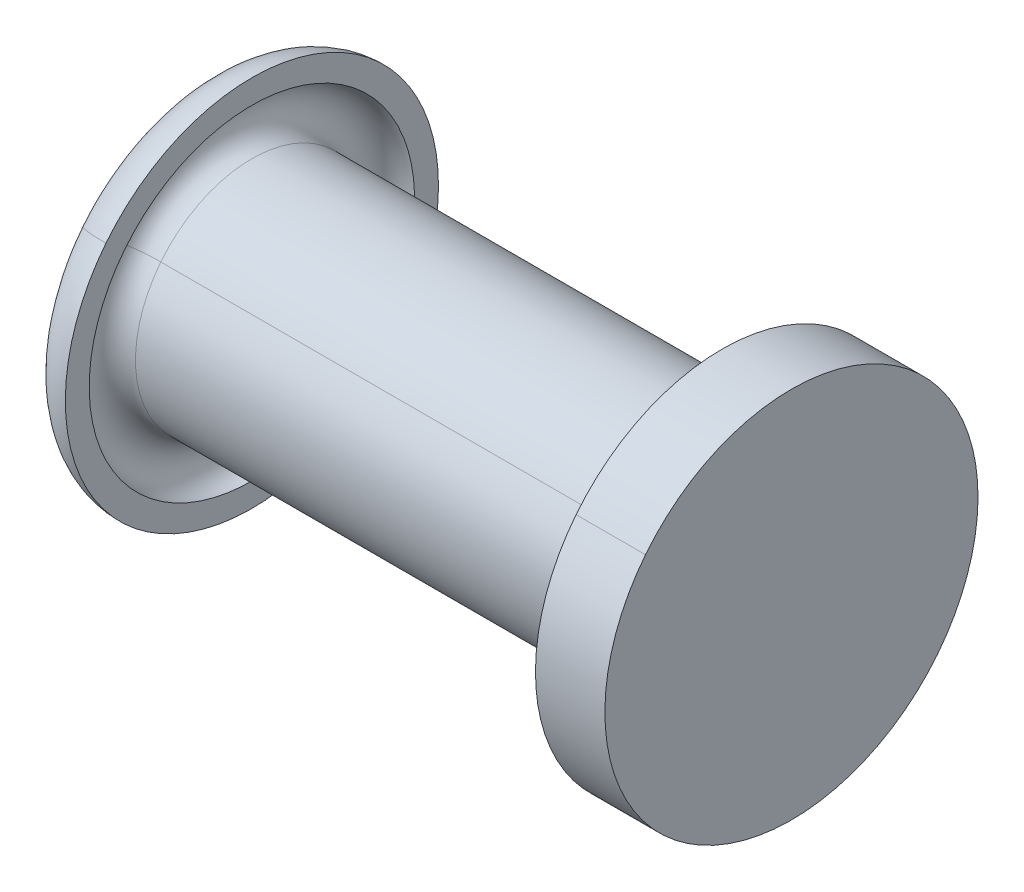
ISO-10303-21;
HEADER;
FILE_DESCRIPTION(('STEP AP214'),'2;1');
FILE_NAME('part.step','',(''),(''),'','','');
FILE_SCHEMA(('AUTOMOTIVE_DESIGN { 1 0 10303 214 1 1 1 1 }'));
ENDSEC;
DATA;
#1=APPLICATION_CONTEXT('core data for automotive mechanical design processes');
#2=APPLICATION_PROTOCOL_DEFINITION('international standard','automotive_design',2000,#1);
#3=PRODUCT_CONTEXT('',#1,'mechanical');
#4=PRODUCT('Part','Part','',(#3));
#5=PRODUCT_RELATED_PRODUCT_CATEGORY('part','',(#4));
#6=PRODUCT_DEFINITION_FORMATION('','',#4);
#7=PRODUCT_DEFINITION_CONTEXT('part definition',#1,'design');
#8=PRODUCT_DEFINITION('design','',#6,#7);
#9=PRODUCT_DEFINITION_SHAPE('','',#8);
#10=(LENGTH_UNIT() NAMED_UNIT(*) SI_UNIT(.MILLI.,.METRE.));
#11=(NAMED_UNIT(*) PLANE_ANGLE_UNIT() SI_UNIT($,.RADIAN.));
#12=(NAMED_UNIT(*) SI_UNIT($,.STERADIAN.) SOLID_ANGLE_UNIT());
#13=UNCERTAINTY_MEASURE_WITH_UNIT(LENGTH_MEASURE(1.E-05),#10,'distance_accuracy_value','');
#14=(GEOMETRIC_REPRESENTATION_CONTEXT(3) GLOBAL_UNCERTAINTY_ASSIGNED_CONTEXT((#13)) GLOBAL_UNIT_ASSIGNED_CONTEXT((#10,
#11,#12)) REPRESENTATION_CONTEXT('',''));
#15=CARTESIAN_POINT('',(0.,0.,0.));
#16=DIRECTION('',(0.,0.,1.));
#17=DIRECTION('',(1.,0.,0.));
#18=AXIS2_PLACEMENT_3D('',#15,#16,#17);
#19=CARTESIAN_POINT('',(10.3632,0.,0.));
#20=DIRECTION('',(-1.,0.,0.));
#21=DIRECTION('',(0.,-0.622747617935157,-0.782422778525835));
#22=AXIS2_PLACEMENT_3D('',#19,#20,#21);
#23=PLANE('',#22);
#24=CARTESIAN_POINT('',(10.3632,0.,0.));
#25=DIRECTION('',(1.,0.,0.));
#26=DIRECTION('',(0.,-0.622747617935157,-0.782422778525835));
#27=AXIS2_PLACEMENT_3D('',#24,#25,#26);
#28=CIRCLE('',#27,6.35);
#29=CARTESIAN_POINT('',(10.3632,-3.95444737388824,-4.96838464363905));
#30=VERTEX_POINT('',#29);
#31=CARTESIAN_POINT('',(10.3632,3.95444737388824,4.96838464363905));
#32=VERTEX_POINT('',#31);
#33=EDGE_CURVE('E11',#30,#32,#28,.T.);
#34=ORIENTED_EDGE('',*,*,#33,.T.);
#35=CARTESIAN_POINT('',(10.3632,0.,0.));
#36=DIRECTION('',(1.,0.,0.));
#37=DIRECTION('',(0.,0.622747617935157,0.782422778525835));
#38=AXIS2_PLACEMENT_3D('',#35,#36,#37);
#39=CIRCLE('',#38,6.35);
#40=EDGE_CURVE('E29',#32,#30,#39,.T.);
#41=ORIENTED_EDGE('',*,*,#40,.T.);
#42=EDGE_LOOP('',(#34,#41));
#43=FACE_BOUND('',#42,.T.);
#44=ADVANCED_FACE('F17',(#43),#23,.F.);
#45=CARTESIAN_POINT('',(33.1437784338811,0.,0.));
#46=DIRECTION('',(1.,0.,0.));
#47=DIRECTION('',(0.,0.622747617935157,0.782422778525835));
#48=AXIS2_PLACEMENT_3D('',#45,#46,#47);
#49=CYLINDRICAL_SURFACE('',#48,6.35);
#50=CARTESIAN_POINT('',(8.00099999999997,0.,0.));
#51=DIRECTION('',(-1.,0.,0.));
#52=DIRECTION('',(0.,0.622747617935158,0.782422778525834));
#53=AXIS2_PLACEMENT_3D('',#50,#51,#52);
#54=CIRCLE('',#53,6.35);
#55=CARTESIAN_POINT('',(8.00099999999998,3.95444737388825,4.96838464363905));
#56=VERTEX_POINT('',#55);
#57=CARTESIAN_POINT('',(8.00099999999998,-3.95444737388824,-4.96838464363905));
#58=VERTEX_POINT('',#57);
#59=EDGE_CURVE('E150',#56,#58,#54,.T.);
#60=ORIENTED_EDGE('',*,*,#59,.F.);
#61=DIRECTION('',(-1.,0.,0.));
#62=VECTOR('',#61,1.);
#63=CARTESIAN_POINT('',(10.3632,3.95444737388824,4.96838464363905));
#64=LINE('',#63,#62);
#65=EDGE_CURVE('E153',#32,#56,#64,.T.);
#66=ORIENTED_EDGE('',*,*,#65,.F.);
#67=ORIENTED_EDGE('',*,*,#33,.F.);
#68=DIRECTION('',(1.,0.,0.));
#69=VECTOR('',#68,1.);
#70=CARTESIAN_POINT('',(8.00099999999998,-3.95444737388825,-4.96838464363905));
#71=LINE('',#70,#69);
#72=EDGE_CURVE('E24',#58,#30,#71,.T.);
#73=ORIENTED_EDGE('',*,*,#72,.F.);
#74=EDGE_LOOP('',(#60,#66,#67,#73));
#75=FACE_BOUND('',#74,.T.);
#76=ADVANCED_FACE('F163',(#75),#49,.T.);
#77=CARTESIAN_POINT('',(33.1437784338811,0.,0.));
#78=DIRECTION('',(1.,0.,0.));
#79=DIRECTION('',(0.,0.622747617935157,0.782422778525835));
#80=AXIS2_PLACEMENT_3D('',#77,#78,#79);
#81=CYLINDRICAL_SURFACE('',#80,6.35);
#82=ORIENTED_EDGE('',*,*,#72,.T.);
#83=ORIENTED_EDGE('',*,*,#40,.F.);
#84=ORIENTED_EDGE('',*,*,#65,.T.);
#85=CARTESIAN_POINT('',(8.00099999999997,0.,0.));
#86=DIRECTION('',(-1.,0.,0.));
#87=DIRECTION('',(0.,-0.622747617935155,-0.782422778525836));
#88=AXIS2_PLACEMENT_3D('',#85,#86,#87);
#89=CIRCLE('',#88,6.35);
#90=EDGE_CURVE('E147',#58,#56,#89,.T.);
#91=ORIENTED_EDGE('',*,*,#90,.F.);
#92=EDGE_LOOP('',(#82,#83,#84,#91));
#93=FACE_BOUND('',#92,.T.);
#94=ADVANCED_FACE('F161',(#93),#81,.T.);
#95=CARTESIAN_POINT('',(8.001,4.96838464363905,-3.95444737388824));
#96=DIRECTION('',(1.,0.,0.));
#97=DIRECTION('',(0.,0.622747617935157,0.782422778525835));
#98=AXIS2_PLACEMENT_3D('',#95,#96,#97);
#99=PLANE('',#98);
#100=CARTESIAN_POINT('',(8.00099999999997,0.,0.));
#101=DIRECTION('',(1.,0.,0.));
#102=DIRECTION('',(0.,-0.622747617935157,-0.782422778525835));
#103=AXIS2_PLACEMENT_3D('',#100,#101,#102);
#104=CIRCLE('',#103,3.9624);
#105=CARTESIAN_POINT('',(8.00099999999999,-2.46757516130626,-3.10027201763077));
#106=VERTEX_POINT('',#105);
#107=CARTESIAN_POINT('',(8.00099999999999,2.46757516130627,3.10027201763077));
#108=VERTEX_POINT('',#107);
#109=EDGE_CURVE('E144',#106,#108,#104,.T.);
#110=ORIENTED_EDGE('',*,*,#109,.T.);
#111=CARTESIAN_POINT('',(8.00099999999997,0.,0.));
#112=DIRECTION('',(1.,0.,0.));
#113=DIRECTION('',(0.,0.622747617935157,0.782422778525835));
#114=AXIS2_PLACEMENT_3D('',#111,#112,#113);
#115=CIRCLE('',#114,3.9624);
#116=EDGE_CURVE('E143',#108,#106,#115,.T.);
#117=ORIENTED_EDGE('',*,*,#116,.T.);
#118=EDGE_LOOP('',(#110,#117));
#119=FACE_BOUND('',#118,.T.);
#120=ORIENTED_EDGE('',*,*,#59,.T.);
#121=ORIENTED_EDGE('',*,*,#90,.T.);
#122=EDGE_LOOP('',(#120,#121));
#123=FACE_BOUND('',#122,.T.);
#124=ADVANCED_FACE('F165',(#119,#123),#99,.F.);
#125=CARTESIAN_POINT('',(33.1437784338811,0.,0.));
#126=DIRECTION('',(1.,0.,0.));
#127=DIRECTION('',(0.,0.622747617935157,0.782422778525835));
#128=AXIS2_PLACEMENT_3D('',#125,#126,#127);
#129=CYLINDRICAL_SURFACE('',#128,3.9624);
#130=DIRECTION('',(1.,0.,0.));
#131=VECTOR('',#130,1.);
#132=CARTESIAN_POINT('',(-8.00100000000002,-2.46757516130627,-3.10027201763077));
#133=LINE('',#132,#131);
#134=CARTESIAN_POINT('',(-8.00100000000001,-2.46757516130626,-3.10027201763077));
#135=VERTEX_POINT('',#134);
#136=EDGE_CURVE('E137',#135,#106,#133,.T.);
#137=ORIENTED_EDGE('',*,*,#136,.T.);
#138=ORIENTED_EDGE('',*,*,#116,.F.);
#139=DIRECTION('',(-1.,0.,0.));
#140=VECTOR('',#139,1.);
#141=CARTESIAN_POINT('',(8.00099999999998,2.46757516130626,3.10027201763077));
#142=LINE('',#141,#140);
#143=CARTESIAN_POINT('',(-8.00100000000001,2.46757516130627,3.10027201763077));
#144=VERTEX_POINT('',#143);
#145=EDGE_CURVE('E141',#108,#144,#142,.T.);
#146=ORIENTED_EDGE('',*,*,#145,.T.);
#147=CARTESIAN_POINT('',(-8.001,0.,0.));
#148=DIRECTION('',(-1.,0.,0.));
#149=DIRECTION('',(0.,-0.622747617935157,-0.782422778525835));
#150=AXIS2_PLACEMENT_3D('',#147,#148,#149);
#151=CIRCLE('',#150,3.9624);
#152=EDGE_CURVE('E130',#135,#144,#151,.T.);
#153=ORIENTED_EDGE('',*,*,#152,.F.);
#154=EDGE_LOOP('',(#137,#138,#146,#153));
#155=FACE_BOUND('',#154,.T.);
#156=ADVANCED_FACE('F167',(#155),#129,.T.);
#157=CARTESIAN_POINT('',(33.1437784338811,0.,0.));
#158=DIRECTION('',(1.,0.,0.));
#159=DIRECTION('',(0.,0.622747617935157,0.782422778525835));
#160=AXIS2_PLACEMENT_3D('',#157,#158,#159);
#161=CYLINDRICAL_SURFACE('',#160,3.9624);
#162=CARTESIAN_POINT('',(-8.001,0.,0.));
#163=DIRECTION('',(-1.,0.,0.));
#164=DIRECTION('',(0.,0.622747617935157,0.782422778525835));
#165=AXIS2_PLACEMENT_3D('',#162,#163,#164);
#166=CIRCLE('',#165,3.9624);
#167=EDGE_CURVE('E133',#144,#135,#166,.T.);
#168=ORIENTED_EDGE('',*,*,#167,.F.);
#169=ORIENTED_EDGE('',*,*,#145,.F.);
#170=ORIENTED_EDGE('',*,*,#109,.F.);
#171=ORIENTED_EDGE('',*,*,#136,.F.);
#172=EDGE_LOOP('',(#168,#169,#170,#171));
#173=FACE_BOUND('',#172,.T.);
#174=ADVANCED_FACE('F175',(#173),#161,.T.);
#175=CARTESIAN_POINT('',(-8.001,0.,0.));
#176=DIRECTION('',(1.,0.,0.));
#177=DIRECTION('',(0.,0.622747617935157,0.782422778525835));
#178=AXIS2_PLACEMENT_3D('',#175,#176,#177);
#179=TOROIDAL_SURFACE('',#178,4.7498,0.787400000000001);
#180=CARTESIAN_POINT('',(-8.001,-2.9579266356684,-3.71635171344202));
#181=DIRECTION('',(0.,-0.782422778525836,0.622747617935155));
#182=DIRECTION('',(0.,0.622747617935155,0.782422778525836));
#183=AXIS2_PLACEMENT_3D('',#180,#181,#182);
#184=CIRCLE('',#183,0.787400000000001);
#185=CARTESIAN_POINT('',(-8.001,-3.44827811003055,-4.33243140925326));
#186=VERTEX_POINT('',#185);
#187=EDGE_CURVE('E129',#135,#186,#184,.T.);
#188=ORIENTED_EDGE('',*,*,#187,.T.);
#189=CARTESIAN_POINT('',(-8.001,0.,0.));
#190=DIRECTION('',(-1.,0.,0.));
#191=DIRECTION('',(0.,0.622747617935158,0.782422778525834));
#192=AXIS2_PLACEMENT_3D('',#189,#190,#191);
#193=CIRCLE('',#192,5.5372);
#194=CARTESIAN_POINT('',(-8.001,3.44827811003055,4.33243140925325));
#195=VERTEX_POINT('',#194);
#196=EDGE_CURVE('E126',#195,#186,#193,.T.);
#197=ORIENTED_EDGE('',*,*,#196,.F.);
#198=CARTESIAN_POINT('',(-8.001,2.95792663566841,3.71635171344201));
#199=DIRECTION('',(0.,-0.782422778525835,0.622747617935157));
#200=DIRECTION('',(0.,0.622747617935157,0.782422778525835));
#201=AXIS2_PLACEMENT_3D('',#198,#199,#200);
#202=CIRCLE('',#201,0.787400000000001);
#203=EDGE_CURVE('E134',#195,#144,#202,.T.);
#204=ORIENTED_EDGE('',*,*,#203,.T.);
#205=ORIENTED_EDGE('',*,*,#167,.T.);
#206=EDGE_LOOP('',(#188,#197,#204,#205));
#207=FACE_BOUND('',#206,.T.);
#208=ADVANCED_FACE('F214',(#207),#179,.F.);
#209=CARTESIAN_POINT('',(-8.001,0.,0.));
#210=DIRECTION('',(1.,0.,0.));
#211=DIRECTION('',(0.,0.622747617935157,0.782422778525835));
#212=AXIS2_PLACEMENT_3D('',#209,#210,#211);
#213=TOROIDAL_SURFACE('',#212,4.7498,0.787400000000001);
#214=ORIENTED_EDGE('',*,*,#152,.T.);
#215=ORIENTED_EDGE('',*,*,#203,.F.);
#216=CARTESIAN_POINT('',(-8.001,0.,0.));
#217=DIRECTION('',(-1.,0.,0.));
#218=DIRECTION('',(0.,-0.622747617935157,-0.782422778525835));
#219=AXIS2_PLACEMENT_3D('',#216,#217,#218);
#220=CIRCLE('',#219,5.5372);
#221=EDGE_CURVE('E122',#186,#195,#220,.T.);
#222=ORIENTED_EDGE('',*,*,#221,.F.);
#223=ORIENTED_EDGE('',*,*,#187,.F.);
#224=EDGE_LOOP('',(#214,#215,#222,#223));
#225=FACE_BOUND('',#224,.T.);
#226=ADVANCED_FACE('F224',(#225),#213,.F.);
#227=CARTESIAN_POINT('',(-8.001,4.33243140925326,-3.44827811003055));
#228=DIRECTION('',(-1.,0.,0.));
#229=DIRECTION('',(0.,-0.622747617935157,-0.782422778525835));
#230=AXIS2_PLACEMENT_3D('',#227,#228,#229);
#231=PLANE('',#230);
#232=ORIENTED_EDGE('',*,*,#196,.T.);
#233=ORIENTED_EDGE('',*,*,#221,.T.);
#234=EDGE_LOOP('',(#232,#233));
#235=FACE_BOUND('',#234,.T.);
#236=CARTESIAN_POINT('',(-8.001,0.,0.));
#237=DIRECTION('',(1.,0.,0.));
#238=DIRECTION('',(0.,-0.622747617935155,-0.782422778525836));
#239=AXIS2_PLACEMENT_3D('',#236,#237,#238);
#240=CIRCLE('',#239,6.35);
#241=CARTESIAN_POINT('',(-8.001,-3.95444737388824,-4.96838464363905));
#242=VERTEX_POINT('',#241);
#243=CARTESIAN_POINT('',(-8.001,3.95444737388825,4.96838464363905));
#244=VERTEX_POINT('',#243);
#245=EDGE_CURVE('E118',#242,#244,#240,.T.);
#246=ORIENTED_EDGE('',*,*,#245,.T.);
#247=CARTESIAN_POINT('',(-8.001,0.,0.));
#248=DIRECTION('',(1.,0.,0.));
#249=DIRECTION('',(0.,0.622747617935158,0.782422778525834));
#250=AXIS2_PLACEMENT_3D('',#247,#248,#249);
#251=CIRCLE('',#250,6.35);
#252=EDGE_CURVE('E117',#244,#242,#251,.T.);
#253=ORIENTED_EDGE('',*,*,#252,.T.);
#254=EDGE_LOOP('',(#246,#253));
#255=FACE_BOUND('',#254,.T.);
#256=ADVANCED_FACE('F234',(#235,#255),#231,.F.);
#257=CARTESIAN_POINT('',(-8.001,0.,0.));
#258=DIRECTION('',(1.,0.,0.));
#259=DIRECTION('',(0.,0.622747617935157,0.782422778525835));
#260=AXIS2_PLACEMENT_3D('',#257,#258,#259);
#261=TOROIDAL_SURFACE('',#260,4.7498,1.6002);
#262=CARTESIAN_POINT('',(-8.001,-2.95792663566841,-3.71635171344201));
#263=DIRECTION('',(0.,-0.782422778525835,0.622747617935157));
#264=DIRECTION('',(0.,0.622747617935157,0.782422778525835));
#265=AXIS2_PLACEMENT_3D('',#262,#263,#264);
#266=CIRCLE('',#265,1.6002);
#267=CARTESIAN_POINT('',(-8.00100000000001,-1.96140589744857,-2.46431878324497));
#268=VERTEX_POINT('',#267);
#269=EDGE_CURVE('E113',#268,#242,#266,.T.);
#270=ORIENTED_EDGE('',*,*,#269,.T.);
#271=ORIENTED_EDGE('',*,*,#252,.F.);
#272=CARTESIAN_POINT('',(-8.001,2.95792663566841,3.71635171344201));
#273=DIRECTION('',(0.,-0.782422778525835,0.622747617935157));
#274=DIRECTION('',(0.,0.622747617935157,0.782422778525835));
#275=AXIS2_PLACEMENT_3D('',#272,#273,#274);
#276=CIRCLE('',#275,1.6002);
#277=CARTESIAN_POINT('',(-8.00100000000001,1.96140589744857,2.46431878324497));
#278=VERTEX_POINT('',#277);
#279=EDGE_CURVE('E115',#244,#278,#276,.T.);
#280=ORIENTED_EDGE('',*,*,#279,.T.);
#281=CARTESIAN_POINT('',(-8.001,0.,0.));
#282=DIRECTION('',(1.,0.,0.));
#283=DIRECTION('',(0.,0.622747617935157,0.782422778525835));
#284=AXIS2_PLACEMENT_3D('',#281,#282,#283);
#285=CIRCLE('',#284,3.1496);
#286=EDGE_CURVE('E110',#278,#268,#285,.T.);
#287=ORIENTED_EDGE('',*,*,#286,.T.);
#288=EDGE_LOOP('',(#270,#271,#280,#287));
#289=FACE_BOUND('',#288,.T.);
#290=ADVANCED_FACE('F244',(#289),#261,.T.);
#291=CARTESIAN_POINT('',(-8.001,0.,0.));
#292=DIRECTION('',(1.,0.,0.));
#293=DIRECTION('',(0.,0.622747617935157,0.782422778525835));
#294=AXIS2_PLACEMENT_3D('',#291,#292,#293);
#295=TOROIDAL_SURFACE('',#294,4.7498,1.6002);
#296=CARTESIAN_POINT('',(-8.001,0.,0.));
#297=DIRECTION('',(1.,0.,0.));
#298=DIRECTION('',(0.,-0.622747617935157,-0.782422778525835));
#299=AXIS2_PLACEMENT_3D('',#296,#297,#298);
#300=CIRCLE('',#299,3.1496);
#301=EDGE_CURVE('E88',#268,#278,#300,.T.);
#302=ORIENTED_EDGE('',*,*,#301,.T.);
#303=ORIENTED_EDGE('',*,*,#279,.F.);
#304=ORIENTED_EDGE('',*,*,#245,.F.);
#305=ORIENTED_EDGE('',*,*,#269,.F.);
#306=EDGE_LOOP('',(#302,#303,#304,#305));
#307=FACE_BOUND('',#306,.T.);
#308=ADVANCED_FACE('F254',(#307),#295,.T.);
#309=CARTESIAN_POINT('',(33.1437784338811,0.,0.));
#310=DIRECTION('',(1.,0.,0.));
#311=DIRECTION('',(0.,0.622747617935157,0.782422778525835));
#312=AXIS2_PLACEMENT_3D('',#309,#310,#311);
#313=CYLINDRICAL_SURFACE('',#312,3.1496);
#314=DIRECTION('',(1.,0.,0.));
#315=VECTOR('',#314,1.);
#316=CARTESIAN_POINT('',(-8.00100000000002,-1.96140589744857,-2.46431878324497));
#317=LINE('',#316,#315);
#318=CARTESIAN_POINT('',(-7.06119999999991,-1.9614058974486,-2.46431878324501));
#319=VERTEX_POINT('',#318);
#320=EDGE_CURVE('E80',#268,#319,#317,.T.);
#321=ORIENTED_EDGE('',*,*,#320,.T.);
#322=CARTESIAN_POINT('',(-7.06119999999986,0.,0.));
#323=DIRECTION('',(-1.,0.,0.));
#324=DIRECTION('',(0.,0.622747617935157,0.782422778525835));
#325=AXIS2_PLACEMENT_3D('',#322,#323,#324);
#326=CIRCLE('',#325,3.14960000000009);
#327=CARTESIAN_POINT('',(-7.06119999999991,1.9614058974486,2.46431878324501));
#328=VERTEX_POINT('',#327);
#329=EDGE_CURVE('E85',#328,#319,#326,.T.);
#330=ORIENTED_EDGE('',*,*,#329,.F.);
#331=DIRECTION('',(-1.,0.,0.));
#332=VECTOR('',#331,1.);
#333=CARTESIAN_POINT('',(-7.06119999999996,1.96140589744857,2.46431878324497));
#334=LINE('',#333,#332);
#335=EDGE_CURVE('E91',#328,#278,#334,.T.);
#336=ORIENTED_EDGE('',*,*,#335,.T.);
#337=ORIENTED_EDGE('',*,*,#301,.F.);
#338=EDGE_LOOP('',(#321,#330,#336,#337));
#339=FACE_BOUND('',#338,.T.);
#340=ADVANCED_FACE('F82',(#339),#313,.F.);
#341=CARTESIAN_POINT('',(33.1437784338811,0.,0.));
#342=DIRECTION('',(1.,0.,0.));
#343=DIRECTION('',(0.,0.622747617935157,0.782422778525835));
#344=AXIS2_PLACEMENT_3D('',#341,#342,#343);
#345=CYLINDRICAL_SURFACE('',#344,3.1496);
#346=ORIENTED_EDGE('',*,*,#286,.F.);
#347=ORIENTED_EDGE('',*,*,#335,.F.);
#348=CARTESIAN_POINT('',(-7.06119999999986,0.,0.));
#349=DIRECTION('',(-1.,0.,0.));
#350=DIRECTION('',(0.,-0.622747617935157,-0.782422778525835));
#351=AXIS2_PLACEMENT_3D('',#348,#349,#350);
#352=CIRCLE('',#351,3.14960000000009);
#353=EDGE_CURVE('E92',#319,#328,#352,.T.);
#354=ORIENTED_EDGE('',*,*,#353,.F.);
#355=ORIENTED_EDGE('',*,*,#320,.F.);
#356=EDGE_LOOP('',(#346,#347,#354,#355));
#357=FACE_BOUND('',#356,.T.);
#358=ADVANCED_FACE('F96',(#357),#345,.F.);
#359=CARTESIAN_POINT('',(-5.16872939431062,0.,0.));
#360=DIRECTION('',(-1.,0.,0.));
#361=DIRECTION('',(0.,-0.622747617935157,-0.782422778525835));
#362=AXIS2_PLACEMENT_3D('',#359,#360,#361);
#363=CONICAL_SURFACE('',#362,0.,1.02974425867666);
#364=DIRECTION('',(0.51503807491005,0.53379889468415,0.670667221076839));
#365=VECTOR('',#364,1.);
#366=CARTESIAN_POINT('',(-7.06119999999986,-1.96140589744862,-2.46431878324504));
#367=LINE('',#366,#365);
#368=CARTESIAN_POINT('',(-5.16872939431062,0.,0.));
#369=VERTEX_POINT('',#368);
#370=EDGE_CURVE('E102',#319,#369,#367,.T.);
#371=ORIENTED_EDGE('',*,*,#370,.F.);
#372=ORIENTED_EDGE('',*,*,#353,.T.);
#373=DIRECTION('',(-0.51503807491005,0.53379889468415,0.670667221076839));
#374=VECTOR('',#373,1.);
#375=CARTESIAN_POINT('',(-5.16872939431062,0.,0.));
#376=LINE('',#375,#374);
#377=EDGE_CURVE('E99',#369,#328,#376,.T.);
#378=ORIENTED_EDGE('',*,*,#377,.F.);
#379=EDGE_LOOP('',(#371,#372,#378));
#380=FACE_BOUND('',#379,.T.);
#381=ADVANCED_FACE('F103',(#380),#363,.F.);
#382=CARTESIAN_POINT('',(-5.16872939431062,0.,0.));
#383=DIRECTION('',(-1.,0.,0.));
#384=DIRECTION('',(0.,-0.622747617935157,-0.782422778525835));
#385=AXIS2_PLACEMENT_3D('',#382,#383,#384);
#386=CONICAL_SURFACE('',#385,0.,1.02974425867666);
#387=ORIENTED_EDGE('',*,*,#377,.T.);
#388=ORIENTED_EDGE('',*,*,#329,.T.);
#389=ORIENTED_EDGE('',*,*,#370,.T.);
#390=EDGE_LOOP('',(#387,#388,#389));
#391=FACE_BOUND('',#390,.T.);
#392=ADVANCED_FACE('F106',(#391),#386,.F.);
#393=CLOSED_SHELL('',(#44,#76,#94,#124,#156,#174,#208,#226,#256,#290,#308,#340,#358,#381,#392));
#394=MANIFOLD_SOLID_BREP('B1',#393);
#395=ADVANCED_BREP_SHAPE_REPRESENTATION('',(#18,#394),#14);
#396=SHAPE_DEFINITION_REPRESENTATION(#9,#395);
ENDSEC;
END-ISO-10303-21;
